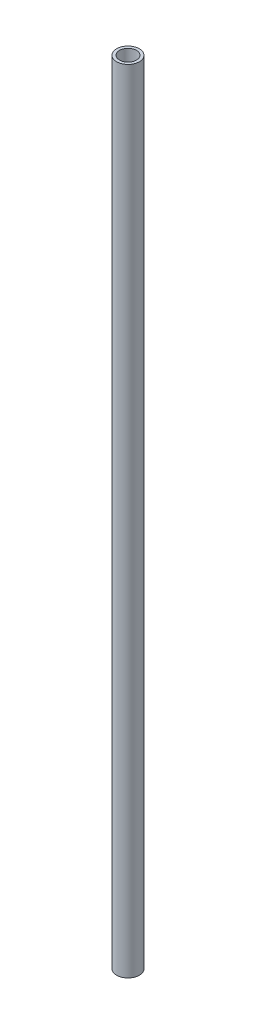
ISO-10303-21;
HEADER;
FILE_DESCRIPTION(('STEP AP214'),'2;1');
FILE_NAME('part.step','',(''),(''),'','','');
FILE_SCHEMA(('AUTOMOTIVE_DESIGN { 1 0 10303 214 1 1 1 1 }'));
ENDSEC;
DATA;
#1=APPLICATION_CONTEXT('core data for automotive mechanical design processes');
#2=APPLICATION_PROTOCOL_DEFINITION('international standard','automotive_design',2000,#1);
#3=PRODUCT_CONTEXT('',#1,'mechanical');
#4=PRODUCT('Part','Part','',(#3));
#5=PRODUCT_RELATED_PRODUCT_CATEGORY('part','',(#4));
#6=PRODUCT_DEFINITION_FORMATION('','',#4);
#7=PRODUCT_DEFINITION_CONTEXT('part definition',#1,'design');
#8=PRODUCT_DEFINITION('design','',#6,#7);
#9=PRODUCT_DEFINITION_SHAPE('','',#8);
#10=(LENGTH_UNIT() NAMED_UNIT(*) SI_UNIT(.MILLI.,.METRE.));
#11=(NAMED_UNIT(*) PLANE_ANGLE_UNIT() SI_UNIT($,.RADIAN.));
#12=(NAMED_UNIT(*) SI_UNIT($,.STERADIAN.) SOLID_ANGLE_UNIT());
#13=UNCERTAINTY_MEASURE_WITH_UNIT(LENGTH_MEASURE(1.E-05),#10,'distance_accuracy_value','');
#14=(GEOMETRIC_REPRESENTATION_CONTEXT(3) GLOBAL_UNCERTAINTY_ASSIGNED_CONTEXT((#13)) GLOBAL_UNIT_ASSIGNED_CONTEXT((#10,
#11,#12)) REPRESENTATION_CONTEXT('',''));
#15=CARTESIAN_POINT('',(0.,0.,0.));
#16=DIRECTION('',(0.,0.,1.));
#17=DIRECTION('',(1.,0.,0.));
#18=AXIS2_PLACEMENT_3D('',#15,#16,#17);
#19=CARTESIAN_POINT('',(0.,280.,0.));
#20=DIRECTION('',(0.,1.,0.));
#21=DIRECTION('',(0.,0.,1.));
#22=AXIS2_PLACEMENT_3D('',#19,#20,#21);
#23=PLANE('',#22);
#24=CARTESIAN_POINT('',(0.,280.,0.));
#25=DIRECTION('',(0.,1.,0.));
#26=DIRECTION('',(0.,0.,1.));
#27=AXIS2_PLACEMENT_3D('',#24,#25,#26);
#28=CIRCLE('',#27,4.);
#29=CARTESIAN_POINT('',(0.,280.,4.));
#30=VERTEX_POINT('',#29);
#31=EDGE_CURVE('E10',#30,#30,#28,.T.);
#32=ORIENTED_EDGE('',*,*,#31,.T.);
#33=EDGE_LOOP('',(#32));
#34=FACE_BOUND('',#33,.T.);
#35=CARTESIAN_POINT('',(0.,280.,0.));
#36=DIRECTION('',(0.,1.,0.));
#37=DIRECTION('',(0.,0.,1.));
#38=AXIS2_PLACEMENT_3D('',#35,#36,#37);
#39=CIRCLE('',#38,3.);
#40=CARTESIAN_POINT('',(0.,280.,3.));
#41=VERTEX_POINT('',#40);
#42=EDGE_CURVE('E44',#41,#41,#39,.T.);
#43=ORIENTED_EDGE('',*,*,#42,.F.);
#44=EDGE_LOOP('',(#43));
#45=FACE_BOUND('',#44,.T.);
#46=ADVANCED_FACE('F33',(#34,#45),#23,.T.);
#47=CARTESIAN_POINT('',(0.,0.,0.));
#48=DIRECTION('',(0.,1.,0.));
#49=DIRECTION('',(0.,0.,1.));
#50=AXIS2_PLACEMENT_3D('',#47,#48,#49);
#51=PLANE('',#50);
#52=CARTESIAN_POINT('',(0.,0.,0.));
#53=DIRECTION('',(0.,1.,0.));
#54=DIRECTION('',(0.,0.,1.));
#55=AXIS2_PLACEMENT_3D('',#52,#53,#54);
#56=CIRCLE('',#55,4.);
#57=CARTESIAN_POINT('',(0.,0.,4.));
#58=VERTEX_POINT('',#57);
#59=EDGE_CURVE('E37',#58,#58,#56,.T.);
#60=ORIENTED_EDGE('',*,*,#59,.F.);
#61=EDGE_LOOP('',(#60));
#62=FACE_BOUND('',#61,.T.);
#63=CARTESIAN_POINT('',(0.,0.,0.));
#64=DIRECTION('',(0.,1.,0.));
#65=DIRECTION('',(0.,0.,1.));
#66=AXIS2_PLACEMENT_3D('',#63,#64,#65);
#67=CIRCLE('',#66,3.);
#68=CARTESIAN_POINT('',(0.,0.,3.));
#69=VERTEX_POINT('',#68);
#70=EDGE_CURVE('E46',#69,#69,#67,.T.);
#71=ORIENTED_EDGE('',*,*,#70,.T.);
#72=EDGE_LOOP('',(#71));
#73=FACE_BOUND('',#72,.T.);
#74=ADVANCED_FACE('F56',(#62,#73),#51,.F.);
#75=CARTESIAN_POINT('',(0.,280.,0.));
#76=DIRECTION('',(0.,-1.,0.));
#77=DIRECTION('',(0.,0.,-1.));
#78=AXIS2_PLACEMENT_3D('',#75,#76,#77);
#79=CYLINDRICAL_SURFACE('',#78,4.);
#80=ORIENTED_EDGE('',*,*,#31,.F.);
#81=EDGE_LOOP('',(#80));
#82=FACE_BOUND('',#81,.T.);
#83=ORIENTED_EDGE('',*,*,#59,.T.);
#84=EDGE_LOOP('',(#83));
#85=FACE_BOUND('',#84,.T.);
#86=ADVANCED_FACE('F35',(#82,#85),#79,.T.);
#87=CARTESIAN_POINT('',(0.,280.,0.));
#88=DIRECTION('',(0.,-1.,0.));
#89=DIRECTION('',(0.,0.,-1.));
#90=AXIS2_PLACEMENT_3D('',#87,#88,#89);
#91=CYLINDRICAL_SURFACE('',#90,3.);
#92=ORIENTED_EDGE('',*,*,#42,.T.);
#93=EDGE_LOOP('',(#92));
#94=FACE_BOUND('',#93,.T.);
#95=ORIENTED_EDGE('',*,*,#70,.F.);
#96=EDGE_LOOP('',(#95));
#97=FACE_BOUND('',#96,.T.);
#98=ADVANCED_FACE('F52',(#94,#97),#91,.F.);
#99=CLOSED_SHELL('',(#46,#74,#86,#98));
#100=MANIFOLD_SOLID_BREP('B2',#99);
#101=ADVANCED_BREP_SHAPE_REPRESENTATION('',(#18,#100),#14);
#102=SHAPE_DEFINITION_REPRESENTATION(#9,#101);
ENDSEC;
END-ISO-10303-21;
